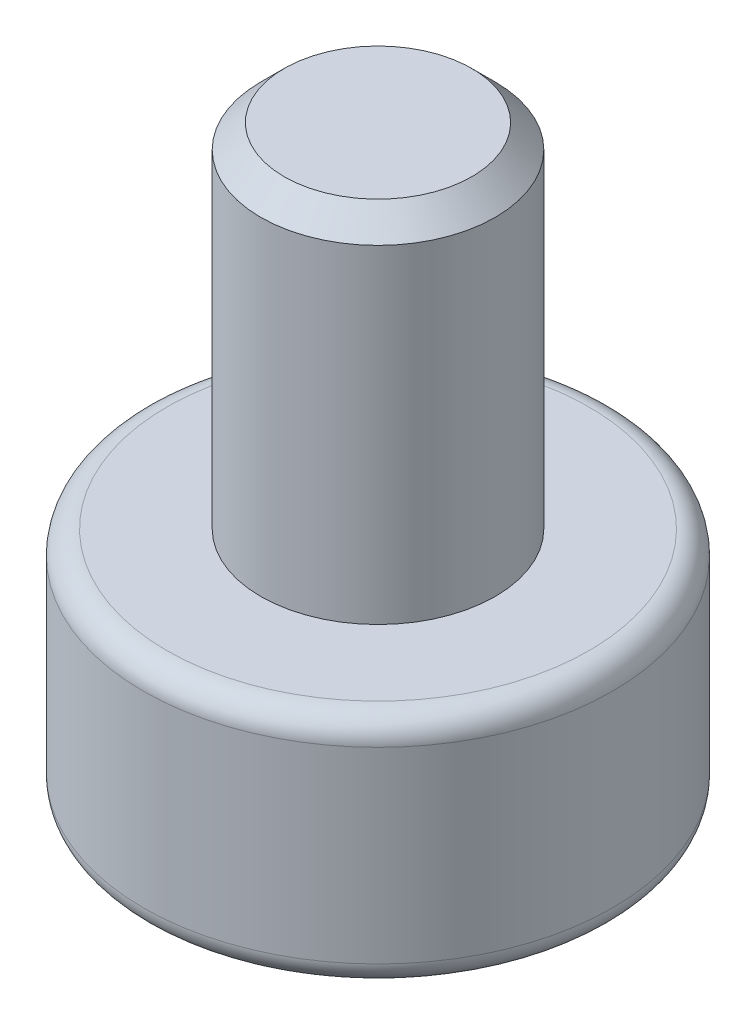
ISO-10303-21;
HEADER;
FILE_DESCRIPTION(('STEP AP214'),'2;1');
FILE_NAME('part.step','',(''),(''),'','','');
FILE_SCHEMA(('AUTOMOTIVE_DESIGN { 1 0 10303 214 1 1 1 1 }'));
ENDSEC;
DATA;
#1=APPLICATION_CONTEXT('core data for automotive mechanical design processes');
#2=APPLICATION_PROTOCOL_DEFINITION('international standard','automotive_design',2000,#1);
#3=PRODUCT_CONTEXT('',#1,'mechanical');
#4=PRODUCT('Part','Part','',(#3));
#5=PRODUCT_RELATED_PRODUCT_CATEGORY('part','',(#4));
#6=PRODUCT_DEFINITION_FORMATION('','',#4);
#7=PRODUCT_DEFINITION_CONTEXT('part definition',#1,'design');
#8=PRODUCT_DEFINITION('design','',#6,#7);
#9=PRODUCT_DEFINITION_SHAPE('','',#8);
#10=(LENGTH_UNIT() NAMED_UNIT(*) SI_UNIT(.MILLI.,.METRE.));
#11=(NAMED_UNIT(*) PLANE_ANGLE_UNIT() SI_UNIT($,.RADIAN.));
#12=(NAMED_UNIT(*) SI_UNIT($,.STERADIAN.) SOLID_ANGLE_UNIT());
#13=UNCERTAINTY_MEASURE_WITH_UNIT(LENGTH_MEASURE(1.E-05),#10,'distance_accuracy_value','');
#14=(GEOMETRIC_REPRESENTATION_CONTEXT(3) GLOBAL_UNCERTAINTY_ASSIGNED_CONTEXT((#13)) GLOBAL_UNIT_ASSIGNED_CONTEXT((#10,
#11,#12)) REPRESENTATION_CONTEXT('',''));
#15=CARTESIAN_POINT('',(0.,0.,0.));
#16=DIRECTION('',(0.,0.,1.));
#17=DIRECTION('',(1.,0.,0.));
#18=AXIS2_PLACEMENT_3D('',#15,#16,#17);
#19=CARTESIAN_POINT('',(0.,2.,0.));
#20=DIRECTION('',(0.,-1.,0.));
#21=DIRECTION('',(0.,0.,-1.));
#22=AXIS2_PLACEMENT_3D('',#19,#20,#21);
#23=CYLINDRICAL_SURFACE('',#22,2.);
#24=CARTESIAN_POINT('',(0.,0.2,0.));
#25=DIRECTION('',(0.,1.,0.));
#26=DIRECTION('',(0.,0.,1.));
#27=AXIS2_PLACEMENT_3D('',#24,#25,#26);
#28=CIRCLE('',#27,2.);
#29=CARTESIAN_POINT('',(0.,0.2,2.));
#30=VERTEX_POINT('',#29);
#31=EDGE_CURVE('E72',#30,#30,#28,.T.);
#32=ORIENTED_EDGE('',*,*,#31,.T.);
#33=EDGE_LOOP('',(#32));
#34=FACE_BOUND('',#33,.T.);
#35=CARTESIAN_POINT('',(0.,1.8,0.));
#36=DIRECTION('',(0.,1.,0.));
#37=DIRECTION('',(0.,0.,1.));
#38=AXIS2_PLACEMENT_3D('',#35,#36,#37);
#39=CIRCLE('',#38,2.);
#40=CARTESIAN_POINT('',(0.,1.8,2.));
#41=VERTEX_POINT('',#40);
#42=EDGE_CURVE('E76',#41,#41,#39,.F.);
#43=ORIENTED_EDGE('',*,*,#42,.T.);
#44=EDGE_LOOP('',(#43));
#45=FACE_BOUND('',#44,.T.);
#46=ADVANCED_FACE('F39',(#34,#45),#23,.T.);
#47=CARTESIAN_POINT('',(0.,2.,0.));
#48=DIRECTION('',(0.,1.,0.));
#49=DIRECTION('',(0.,0.,1.));
#50=AXIS2_PLACEMENT_3D('',#47,#48,#49);
#51=PLANE('',#50);
#52=CARTESIAN_POINT('',(0.,2.,0.));
#53=DIRECTION('',(0.,1.,0.));
#54=DIRECTION('',(0.,0.,1.));
#55=AXIS2_PLACEMENT_3D('',#52,#53,#54);
#56=CIRCLE('',#55,1.8);
#57=CARTESIAN_POINT('',(0.,2.,1.8));
#58=VERTEX_POINT('',#57);
#59=EDGE_CURVE('E64',#58,#58,#56,.T.);
#60=ORIENTED_EDGE('',*,*,#59,.T.);
#61=EDGE_LOOP('',(#60));
#62=FACE_BOUND('',#61,.T.);
#63=CARTESIAN_POINT('',(0.,2.,0.));
#64=DIRECTION('',(0.,1.,0.));
#65=DIRECTION('',(0.,0.,1.));
#66=AXIS2_PLACEMENT_3D('',#63,#64,#65);
#67=CIRCLE('',#66,1.);
#68=CARTESIAN_POINT('',(0.,2.,1.));
#69=VERTEX_POINT('',#68);
#70=EDGE_CURVE('E80',#69,#69,#67,.T.);
#71=ORIENTED_EDGE('',*,*,#70,.F.);
#72=EDGE_LOOP('',(#71));
#73=FACE_BOUND('',#72,.T.);
#74=ADVANCED_FACE('F107',(#62,#73),#51,.T.);
#75=CARTESIAN_POINT('',(0.,0.,0.));
#76=DIRECTION('',(0.,1.,0.));
#77=DIRECTION('',(0.,0.,1.));
#78=AXIS2_PLACEMENT_3D('',#75,#76,#77);
#79=PLANE('',#78);
#80=CARTESIAN_POINT('',(0.,0.,0.));
#81=DIRECTION('',(0.,1.,0.));
#82=DIRECTION('',(0.,0.,1.));
#83=AXIS2_PLACEMENT_3D('',#80,#81,#82);
#84=CIRCLE('',#83,0.865);
#85=CARTESIAN_POINT('',(0.,0.,0.865));
#86=VERTEX_POINT('',#85);
#87=EDGE_CURVE('E53',#86,#86,#84,.T.);
#88=ORIENTED_EDGE('',*,*,#87,.T.);
#89=EDGE_LOOP('',(#88));
#90=FACE_BOUND('',#89,.T.);
#91=CARTESIAN_POINT('',(0.,0.,0.));
#92=DIRECTION('',(0.,1.,0.));
#93=DIRECTION('',(0.,0.,1.));
#94=AXIS2_PLACEMENT_3D('',#91,#92,#93);
#95=CIRCLE('',#94,1.8);
#96=CARTESIAN_POINT('',(0.,0.,1.8));
#97=VERTEX_POINT('',#96);
#98=EDGE_CURVE('E68',#97,#97,#95,.F.);
#99=ORIENTED_EDGE('',*,*,#98,.T.);
#100=EDGE_LOOP('',(#99));
#101=FACE_BOUND('',#100,.T.);
#102=ADVANCED_FACE('F113',(#90,#101),#79,.F.);
#103=CARTESIAN_POINT('',(0.,5.,0.));
#104=DIRECTION('',(0.,-1.,0.));
#105=DIRECTION('',(0.,0.,-1.));
#106=AXIS2_PLACEMENT_3D('',#103,#104,#105);
#107=CYLINDRICAL_SURFACE('',#106,1.);
#108=CARTESIAN_POINT('',(0.,4.8,0.));
#109=DIRECTION('',(0.,1.,0.));
#110=DIRECTION('',(0.,0.,1.));
#111=AXIS2_PLACEMENT_3D('',#108,#109,#110);
#112=CIRCLE('',#111,1.);
#113=CARTESIAN_POINT('',(0.,4.8,1.));
#114=VERTEX_POINT('',#113);
#115=EDGE_CURVE('E10',#114,#114,#112,.F.);
#116=ORIENTED_EDGE('',*,*,#115,.T.);
#117=EDGE_LOOP('',(#116));
#118=FACE_BOUND('',#117,.T.);
#119=ORIENTED_EDGE('',*,*,#70,.T.);
#120=EDGE_LOOP('',(#119));
#121=FACE_BOUND('',#120,.T.);
#122=ADVANCED_FACE('F137',(#118,#121),#107,.T.);
#123=CARTESIAN_POINT('',(0.,5.,0.));
#124=DIRECTION('',(0.,1.,0.));
#125=DIRECTION('',(0.,0.,1.));
#126=AXIS2_PLACEMENT_3D('',#123,#124,#125);
#127=PLANE('',#126);
#128=CARTESIAN_POINT('',(0.,5.,0.));
#129=DIRECTION('',(0.,1.,0.));
#130=DIRECTION('',(0.,0.,1.));
#131=AXIS2_PLACEMENT_3D('',#128,#129,#130);
#132=CIRCLE('',#131,0.799999999999999);
#133=CARTESIAN_POINT('',(0.,5.,0.799999999999999));
#134=VERTEX_POINT('',#133);
#135=EDGE_CURVE('E48',#134,#134,#132,.T.);
#136=ORIENTED_EDGE('',*,*,#135,.T.);
#137=EDGE_LOOP('',(#136));
#138=FACE_BOUND('',#137,.T.);
#139=ADVANCED_FACE('F120',(#138),#127,.T.);
#140=CARTESIAN_POINT('',(0.,0.2,0.));
#141=DIRECTION('',(0.,1.,0.));
#142=DIRECTION('',(0.,0.,1.));
#143=AXIS2_PLACEMENT_3D('',#140,#141,#142);
#144=TOROIDAL_SURFACE('',#143,1.8,0.2);
#145=ORIENTED_EDGE('',*,*,#98,.F.);
#146=EDGE_LOOP('',(#145));
#147=FACE_BOUND('',#146,.T.);
#148=ORIENTED_EDGE('',*,*,#31,.F.);
#149=EDGE_LOOP('',(#148));
#150=FACE_BOUND('',#149,.T.);
#151=ADVANCED_FACE('F102',(#147,#150),#144,.T.);
#152=CARTESIAN_POINT('',(0.,1.8,0.));
#153=DIRECTION('',(0.,1.,0.));
#154=DIRECTION('',(0.,0.,1.));
#155=AXIS2_PLACEMENT_3D('',#152,#153,#154);
#156=TOROIDAL_SURFACE('',#155,1.8,0.2);
#157=ORIENTED_EDGE('',*,*,#42,.F.);
#158=EDGE_LOOP('',(#157));
#159=FACE_BOUND('',#158,.T.);
#160=ORIENTED_EDGE('',*,*,#59,.F.);
#161=EDGE_LOOP('',(#160));
#162=FACE_BOUND('',#161,.T.);
#163=ADVANCED_FACE('F93',(#159,#162),#156,.T.);
#164=CARTESIAN_POINT('',(0.,1.52,0.));
#165=DIRECTION('',(0.,-1.,0.));
#166=DIRECTION('',(0.,0.,-1.));
#167=AXIS2_PLACEMENT_3D('',#164,#165,#166);
#168=CYLINDRICAL_SURFACE('',#167,0.765);
#169=CARTESIAN_POINT('',(0.,0.1,0.));
#170=DIRECTION('',(0.,1.,0.));
#171=DIRECTION('',(0.,0.,1.));
#172=AXIS2_PLACEMENT_3D('',#169,#170,#171);
#173=CIRCLE('',#172,0.765);
#174=CARTESIAN_POINT('',(0.,0.1,0.765));
#175=VERTEX_POINT('',#174);
#176=EDGE_CURVE('E58',#175,#175,#173,.F.);
#177=ORIENTED_EDGE('',*,*,#176,.T.);
#178=EDGE_LOOP('',(#177));
#179=FACE_BOUND('',#178,.T.);
#180=CARTESIAN_POINT('',(0.,1.52,0.));
#181=DIRECTION('',(0.,-1.,0.));
#182=DIRECTION('',(0.,0.,-1.));
#183=AXIS2_PLACEMENT_3D('',#180,#181,#182);
#184=CIRCLE('',#183,0.765);
#185=CARTESIAN_POINT('',(0.,1.52,-0.765));
#186=VERTEX_POINT('',#185);
#187=EDGE_CURVE('E84',#186,#186,#184,.T.);
#188=ORIENTED_EDGE('',*,*,#187,.F.);
#189=EDGE_LOOP('',(#188));
#190=FACE_BOUND('',#189,.T.);
#191=ADVANCED_FACE('F91',(#179,#190),#168,.F.);
#192=CARTESIAN_POINT('',(0.,1.52,0.));
#193=DIRECTION('',(0.,-1.,0.));
#194=DIRECTION('',(0.,0.,-1.));
#195=AXIS2_PLACEMENT_3D('',#192,#193,#194);
#196=PLANE('',#195);
#197=ORIENTED_EDGE('',*,*,#187,.T.);
#198=EDGE_LOOP('',(#197));
#199=FACE_BOUND('',#198,.T.);
#200=ADVANCED_FACE('F89',(#199),#196,.T.);
#201=CARTESIAN_POINT('',(0.,0.1,0.));
#202=DIRECTION('',(0.,-1.,0.));
#203=DIRECTION('',(0.,0.,-1.));
#204=AXIS2_PLACEMENT_3D('',#201,#202,#203);
#205=CONICAL_SURFACE('',#204,0.765,0.785398163397448);
#206=ORIENTED_EDGE('',*,*,#87,.F.);
#207=EDGE_LOOP('',(#206));
#208=FACE_BOUND('',#207,.T.);
#209=ORIENTED_EDGE('',*,*,#176,.F.);
#210=EDGE_LOOP('',(#209));
#211=FACE_BOUND('',#210,.T.);
#212=ADVANCED_FACE('F100',(#208,#211),#205,.F.);
#213=CARTESIAN_POINT('',(0.,5.,0.));
#214=DIRECTION('',(0.,-1.,0.));
#215=DIRECTION('',(0.,0.,-1.));
#216=AXIS2_PLACEMENT_3D('',#213,#214,#215);
#217=CONICAL_SURFACE('',#216,0.799999999999999,0.785398163397446);
#218=ORIENTED_EDGE('',*,*,#115,.F.);
#219=EDGE_LOOP('',(#218));
#220=FACE_BOUND('',#219,.T.);
#221=ORIENTED_EDGE('',*,*,#135,.F.);
#222=EDGE_LOOP('',(#221));
#223=FACE_BOUND('',#222,.T.);
#224=ADVANCED_FACE('F42',(#220,#223),#217,.T.);
#225=CLOSED_SHELL('',(#46,#74,#102,#122,#139,#151,#163,#191,#200,#212,#224));
#226=MANIFOLD_SOLID_BREP('B2',#225);
#227=ADVANCED_BREP_SHAPE_REPRESENTATION('',(#18,#226),#14);
#228=SHAPE_DEFINITION_REPRESENTATION(#9,#227);
ENDSEC;
END-ISO-10303-21;
